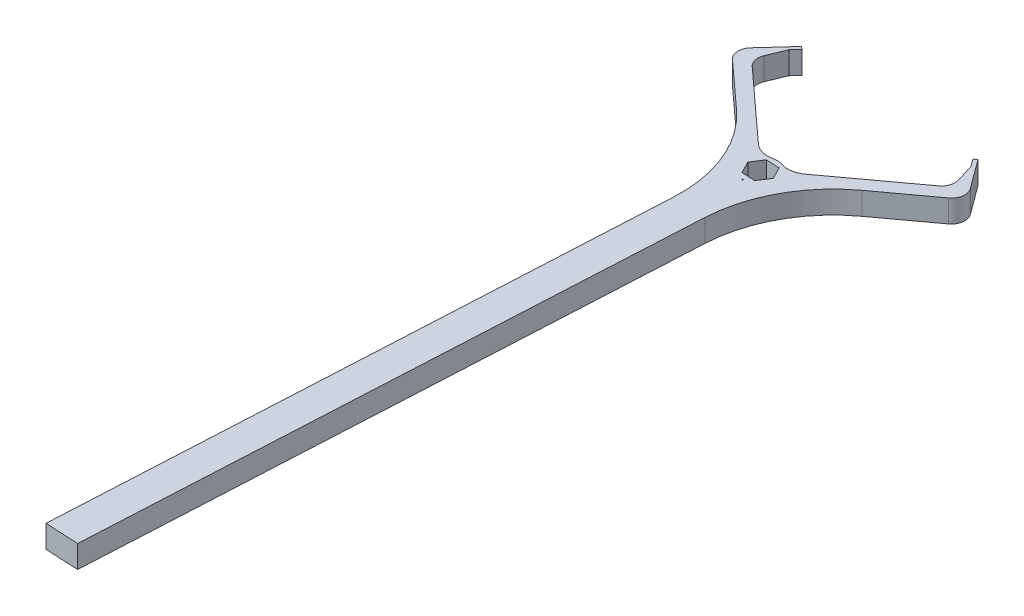
ISO-10303-21;
HEADER;
FILE_DESCRIPTION(('STEP AP214'),'2;1');
FILE_NAME('part.step','',(''),(''),'','','');
FILE_SCHEMA(('AUTOMOTIVE_DESIGN { 1 0 10303 214 1 1 1 1 }'));
ENDSEC;
DATA;
#1=APPLICATION_CONTEXT('core data for automotive mechanical design processes');
#2=APPLICATION_PROTOCOL_DEFINITION('international standard','automotive_design',2000,#1);
#3=PRODUCT_CONTEXT('',#1,'mechanical');
#4=PRODUCT('Part','Part','',(#3));
#5=PRODUCT_RELATED_PRODUCT_CATEGORY('part','',(#4));
#6=PRODUCT_DEFINITION_FORMATION('','',#4);
#7=PRODUCT_DEFINITION_CONTEXT('part definition',#1,'design');
#8=PRODUCT_DEFINITION('design','',#6,#7);
#9=PRODUCT_DEFINITION_SHAPE('','',#8);
#10=(LENGTH_UNIT() NAMED_UNIT(*) SI_UNIT(.MILLI.,.METRE.));
#11=(NAMED_UNIT(*) PLANE_ANGLE_UNIT() SI_UNIT($,.RADIAN.));
#12=(NAMED_UNIT(*) SI_UNIT($,.STERADIAN.) SOLID_ANGLE_UNIT());
#13=UNCERTAINTY_MEASURE_WITH_UNIT(LENGTH_MEASURE(1.E-05),#10,'distance_accuracy_value','');
#14=(GEOMETRIC_REPRESENTATION_CONTEXT(3) GLOBAL_UNCERTAINTY_ASSIGNED_CONTEXT((#13)) GLOBAL_UNIT_ASSIGNED_CONTEXT((#10,
#11,#12)) REPRESENTATION_CONTEXT('',''));
#15=CARTESIAN_POINT('',(0.,0.,0.));
#16=DIRECTION('',(0.,0.,1.));
#17=DIRECTION('',(1.,0.,0.));
#18=AXIS2_PLACEMENT_3D('',#15,#16,#17);
#19=CARTESIAN_POINT('',(-9.82024110292599,0.,187.11250301077));
#20=DIRECTION('',(-0.0524109507479032,0.,0.998625601635418));
#21=DIRECTION('',(0.998625601635418,0.,0.0524109507479032));
#22=AXIS2_PLACEMENT_3D('',#19,#20,#21);
#23=PLANE('',#22);
#24=DIRECTION('',(0.,1.,0.));
#25=VECTOR('',#24,1.);
#26=CARTESIAN_POINT('',(-11.4215991400609,2.5,187.028458803334));
#27=LINE('',#26,#25);
#28=CARTESIAN_POINT('',(-11.4215991400609,-2.5,187.028458803334));
#29=VERTEX_POINT('',#28);
#30=CARTESIAN_POINT('',(-11.4215991400609,2.5,187.028458803334));
#31=VERTEX_POINT('',#30);
#32=EDGE_CURVE('E176',#29,#31,#27,.T.);
#33=ORIENTED_EDGE('',*,*,#32,.F.);
#34=DIRECTION('',(0.998625601635418,0.,0.0524109507479032));
#35=VECTOR('',#34,1.);
#36=CARTESIAN_POINT('',(-9.82024110292599,-2.5,187.11250301077));
#37=LINE('',#36,#35);
#38=CARTESIAN_POINT('',(-4.03176968795879,-2.5,187.416299838869));
#39=VERTEX_POINT('',#38);
#40=EDGE_CURVE('E182',#29,#39,#37,.T.);
#41=ORIENTED_EDGE('',*,*,#40,.T.);
#42=DIRECTION('',(0.,1.,0.));
#43=VECTOR('',#42,1.);
#44=CARTESIAN_POINT('',(-4.0317696879588,2.5,187.416299838869));
#45=LINE('',#44,#43);
#46=CARTESIAN_POINT('',(-4.03176968795879,2.5,187.416299838869));
#47=VERTEX_POINT('',#46);
#48=EDGE_CURVE('E179',#39,#47,#45,.T.);
#49=ORIENTED_EDGE('',*,*,#48,.T.);
#50=DIRECTION('',(0.998625601635418,0.,0.0524109507479032));
#51=VECTOR('',#50,1.);
#52=CARTESIAN_POINT('',(-9.82024110292599,2.5,187.11250301077));
#53=LINE('',#52,#51);
#54=EDGE_CURVE('E172',#31,#47,#53,.T.);
#55=ORIENTED_EDGE('',*,*,#54,.F.);
#56=EDGE_LOOP('',(#33,#41,#49,#55));
#57=FACE_BOUND('',#56,.T.);
#58=ADVANCED_FACE('F35',(#57),#23,.T.);
#59=CARTESIAN_POINT('',(-34.4423896428789,2.5,53.2615811955908));
#60=DIRECTION('',(0.,-1.,0.));
#61=DIRECTION('',(0.,0.,-1.));
#62=AXIS2_PLACEMENT_3D('',#59,#60,#61);
#63=CYLINDRICAL_SURFACE('',#62,30.);
#64=CARTESIAN_POINT('',(-34.4423896428789,2.5,53.2615811955908));
#65=DIRECTION('',(0.,1.,0.));
#66=DIRECTION('',(0.,0.,1.));
#67=AXIS2_PLACEMENT_3D('',#64,#65,#66);
#68=CIRCLE('',#67,30.);
#69=CARTESIAN_POINT('',(-14.2370418585784,2.5,31.0862814024547));
#70=VERTEX_POINT('',#69);
#71=CARTESIAN_POINT('',(-4.48362159381635,2.5,54.8339097180279));
#72=VERTEX_POINT('',#71);
#73=EDGE_CURVE('E336',#70,#72,#68,.F.);
#74=ORIENTED_EDGE('',*,*,#73,.F.);
#75=DIRECTION('',(0.,-1.,0.));
#76=VECTOR('',#75,1.);
#77=CARTESIAN_POINT('',(-14.2370418585784,2.5,31.0862814024547));
#78=LINE('',#77,#76);
#79=CARTESIAN_POINT('',(-14.2370418585784,-2.5,31.0862814024547));
#80=VERTEX_POINT('',#79);
#81=EDGE_CURVE('E347',#80,#70,#78,.F.);
#82=ORIENTED_EDGE('',*,*,#81,.F.);
#83=CARTESIAN_POINT('',(-34.4423896428789,-2.5,53.2615811955908));
#84=DIRECTION('',(0.,1.,0.));
#85=DIRECTION('',(0.,0.,1.));
#86=AXIS2_PLACEMENT_3D('',#83,#84,#85);
#87=CIRCLE('',#86,30.);
#88=CARTESIAN_POINT('',(-4.48362159381635,-2.5,54.8339097180279));
#89=VERTEX_POINT('',#88);
#90=EDGE_CURVE('E339',#89,#80,#87,.T.);
#91=ORIENTED_EDGE('',*,*,#90,.F.);
#92=DIRECTION('',(0.,-1.,0.));
#93=VECTOR('',#92,1.);
#94=CARTESIAN_POINT('',(-4.48362159381635,2.5,54.8339097180279));
#95=LINE('',#94,#93);
#96=EDGE_CURVE('E350',#72,#89,#95,.T.);
#97=ORIENTED_EDGE('',*,*,#96,.F.);
#98=EDGE_LOOP('',(#74,#82,#91,#97));
#99=FACE_BOUND('',#98,.T.);
#100=ADVANCED_FACE('F511',(#99),#63,.F.);
#101=CARTESIAN_POINT('',(-21.9342967580497,2.5,24.0728153533342));
#102=DIRECTION('',(0.673511592810017,0.,-0.739176659771204));
#103=DIRECTION('',(-0.739176659771204,0.,-0.673511592810017));
#104=AXIS2_PLACEMENT_3D('',#101,#102,#103);
#105=PLANE('',#104);
#106=DIRECTION('',(0.739176659771204,0.,0.673511592810017));
#107=VECTOR('',#106,1.);
#108=CARTESIAN_POINT('',(-21.9342967580497,2.5,24.0728153533342));
#109=LINE('',#108,#107);
#110=CARTESIAN_POINT('',(-24.3989513676046,2.5,21.8271093642927));
#111=VERTEX_POINT('',#110);
#112=EDGE_CURVE('E191',#111,#70,#109,.T.);
#113=ORIENTED_EDGE('',*,*,#112,.F.);
#114=DIRECTION('',(0.,-1.,0.));
#115=VECTOR('',#114,1.);
#116=CARTESIAN_POINT('',(-24.3989513676046,2.5,21.8271093642927));
#117=LINE('',#116,#115);
#118=CARTESIAN_POINT('',(-24.3989513676046,-2.5,21.8271093642927));
#119=VERTEX_POINT('',#118);
#120=EDGE_CURVE('E871',#111,#119,#117,.T.);
#121=ORIENTED_EDGE('',*,*,#120,.T.);
#122=DIRECTION('',(0.739176659771204,0.,0.673511592810017));
#123=VECTOR('',#122,1.);
#124=CARTESIAN_POINT('',(-21.9342967580497,-2.5,24.0728153533342));
#125=LINE('',#124,#123);
#126=EDGE_CURVE('E202',#119,#80,#125,.T.);
#127=ORIENTED_EDGE('',*,*,#126,.T.);
#128=ORIENTED_EDGE('',*,*,#81,.T.);
#129=EDGE_LOOP('',(#113,#121,#127,#128));
#130=FACE_BOUND('',#129,.T.);
#131=ADVANCED_FACE('F513',(#130),#105,.F.);
#132=CARTESIAN_POINT('',(-22.3784165891746,2.5,19.6095793849791));
#133=DIRECTION('',(0.,-1.,0.));
#134=DIRECTION('',(0.,0.,-1.));
#135=AXIS2_PLACEMENT_3D('',#132,#133,#134);
#136=CYLINDRICAL_SURFACE('',#135,3.);
#137=CARTESIAN_POINT('',(-22.3784165891746,2.5,19.6095793849791));
#138=DIRECTION('',(0.,1.,0.));
#139=DIRECTION('',(0.,0.,1.));
#140=AXIS2_PLACEMENT_3D('',#137,#138,#139);
#141=CIRCLE('',#140,3.);
#142=CARTESIAN_POINT('',(-24.5959465684882,2.5,17.589044606549));
#143=VERTEX_POINT('',#142);
#144=EDGE_CURVE('E296',#143,#111,#141,.T.);
#145=ORIENTED_EDGE('',*,*,#144,.F.);
#146=DIRECTION('',(0.,-1.,0.));
#147=VECTOR('',#146,1.);
#148=CARTESIAN_POINT('',(-24.5959465684882,2.5,17.589044606549));
#149=LINE('',#148,#147);
#150=CARTESIAN_POINT('',(-24.5959465684882,-2.5,17.589044606549));
#151=VERTEX_POINT('',#150);
#152=EDGE_CURVE('E868',#151,#143,#149,.F.);
#153=ORIENTED_EDGE('',*,*,#152,.F.);
#154=CARTESIAN_POINT('',(-22.3784165891746,-2.5,19.6095793849791));
#155=DIRECTION('',(0.,1.,0.));
#156=DIRECTION('',(0.,0.,1.));
#157=AXIS2_PLACEMENT_3D('',#154,#155,#156);
#158=CIRCLE('',#157,3.);
#159=EDGE_CURVE('E309',#119,#151,#158,.F.);
#160=ORIENTED_EDGE('',*,*,#159,.F.);
#161=ORIENTED_EDGE('',*,*,#120,.F.);
#162=EDGE_LOOP('',(#145,#153,#160,#161));
#163=FACE_BOUND('',#162,.T.);
#164=ADVANCED_FACE('F520',(#163),#136,.T.);
#165=CARTESIAN_POINT('',(-4.6821845888686,2.5,-4.26624076747159));
#166=DIRECTION('',(0.739176659771206,0.,0.673511592810014));
#167=DIRECTION('',(0.673511592810014,0.,-0.739176659771206));
#168=AXIS2_PLACEMENT_3D('',#165,#166,#167);
#169=PLANE('',#168);
#170=DIRECTION('',(-0.673511592810014,0.,0.739176659771206));
#171=VECTOR('',#170,1.);
#172=CARTESIAN_POINT('',(-4.6821845888686,-2.5,-4.26624076747159));
#173=LINE('',#172,#171);
#174=CARTESIAN_POINT('',(-19.2078538260081,-2.5,11.6756313283794));
#175=VERTEX_POINT('',#174);
#176=EDGE_CURVE('E214',#175,#151,#173,.T.);
#177=ORIENTED_EDGE('',*,*,#176,.T.);
#178=ORIENTED_EDGE('',*,*,#152,.T.);
#179=DIRECTION('',(-0.673511592810014,0.,0.739176659771206));
#180=VECTOR('',#179,1.);
#181=CARTESIAN_POINT('',(-4.6821845888686,2.5,-4.26624076747159));
#182=LINE('',#181,#180);
#183=CARTESIAN_POINT('',(-19.2078538260081,2.5,11.6756313283794));
#184=VERTEX_POINT('',#183);
#185=EDGE_CURVE('E250',#184,#143,#182,.T.);
#186=ORIENTED_EDGE('',*,*,#185,.F.);
#187=DIRECTION('',(0.,-1.,0.));
#188=VECTOR('',#187,1.);
#189=CARTESIAN_POINT('',(-19.2078538260081,2.5,11.6756313283794));
#190=LINE('',#189,#188);
#191=EDGE_CURVE('E413',#184,#175,#190,.T.);
#192=ORIENTED_EDGE('',*,*,#191,.T.);
#193=EDGE_LOOP('',(#177,#178,#186,#192));
#194=FACE_BOUND('',#193,.T.);
#195=ADVANCED_FACE('F590',(#194),#169,.F.);
#196=CARTESIAN_POINT('',(-14.5256692371395,2.5,15.9418720958509));
#197=DIRECTION('',(-0.673511592810017,0.,0.739176659771203));
#198=DIRECTION('',(0.739176659771203,0.,0.673511592810017));
#199=AXIS2_PLACEMENT_3D('',#196,#197,#198);
#200=PLANE('',#199);
#201=DIRECTION('',(-0.739176659771203,0.,-0.673511592810017));
#202=VECTOR('',#201,1.);
#203=CARTESIAN_POINT('',(-14.5256692371395,-2.5,15.9418720958509));
#204=LINE('',#203,#202);
#205=CARTESIAN_POINT('',(-18.6165124981911,-2.5,12.2144406026274));
#206=VERTEX_POINT('',#205);
#207=EDGE_CURVE('E217',#206,#175,#204,.T.);
#208=ORIENTED_EDGE('',*,*,#207,.T.);
#209=ORIENTED_EDGE('',*,*,#191,.F.);
#210=DIRECTION('',(-0.739176659771203,0.,-0.673511592810017));
#211=VECTOR('',#210,1.);
#212=CARTESIAN_POINT('',(-14.5256692371395,2.5,15.9418720958509));
#213=LINE('',#212,#211);
#214=CARTESIAN_POINT('',(-18.6165124981911,2.5,12.2144406026274));
#215=VERTEX_POINT('',#214);
#216=EDGE_CURVE('E253',#215,#184,#213,.T.);
#217=ORIENTED_EDGE('',*,*,#216,.F.);
#218=DIRECTION('',(0.,-1.,0.));
#219=VECTOR('',#218,1.);
#220=CARTESIAN_POINT('',(-18.6165124981911,2.5,12.2144406026274));
#221=LINE('',#220,#219);
#222=EDGE_CURVE('E411',#215,#206,#221,.T.);
#223=ORIENTED_EDGE('',*,*,#222,.T.);
#224=EDGE_LOOP('',(#208,#209,#217,#223));
#225=FACE_BOUND('',#224,.T.);
#226=ADVANCED_FACE('F586',(#225),#200,.F.);
#227=CARTESIAN_POINT('',(-4.09084326105156,2.5,-3.72743149322354));
#228=DIRECTION('',(0.739176659771203,0.,0.673511592810017));
#229=DIRECTION('',(0.673511592810017,0.,-0.739176659771203));
#230=AXIS2_PLACEMENT_3D('',#227,#228,#229);
#231=PLANE('',#230);
#232=DIRECTION('',(-0.673511592810017,0.,0.739176659771203));
#233=VECTOR('',#232,1.);
#234=CARTESIAN_POINT('',(-4.09084326105156,-2.5,-3.72743149322354));
#235=LINE('',#234,#233);
#236=CARTESIAN_POINT('',(-20.0034246908169,-2.5,13.7365719703502));
#237=VERTEX_POINT('',#236);
#238=EDGE_CURVE('E219',#206,#237,#235,.T.);
#239=ORIENTED_EDGE('',*,*,#238,.F.);
#240=ORIENTED_EDGE('',*,*,#222,.F.);
#241=DIRECTION('',(-0.673511592810017,0.,0.739176659771203));
#242=VECTOR('',#241,1.);
#243=CARTESIAN_POINT('',(-4.09084326105156,2.5,-3.72743149322354));
#244=LINE('',#243,#242);
#245=CARTESIAN_POINT('',(-20.0034246908169,2.5,13.7365719703502));
#246=VERTEX_POINT('',#245);
#247=EDGE_CURVE('E255',#215,#246,#244,.T.);
#248=ORIENTED_EDGE('',*,*,#247,.T.);
#249=DIRECTION('',(0.,-1.,0.));
#250=VECTOR('',#249,1.);
#251=CARTESIAN_POINT('',(-20.0034246908169,2.5,13.7365719703502));
#252=LINE('',#251,#250);
#253=EDGE_CURVE('E409',#246,#237,#252,.T.);
#254=ORIENTED_EDGE('',*,*,#253,.T.);
#255=EDGE_LOOP('',(#239,#240,#248,#254));
#256=FACE_BOUND('',#255,.T.);
#257=ADVANCED_FACE('F582',(#256),#231,.T.);
#258=CARTESIAN_POINT('',(-12.284519840187,2.5,-5.04793791991461));
#259=DIRECTION('',(0.924953384148559,0.,0.380080566659397));
#260=DIRECTION('',(0.380080566659397,0.,-0.924953384148559));
#261=AXIS2_PLACEMENT_3D('',#258,#259,#260);
#262=PLANE('',#261);
#263=DIRECTION('',(-0.380080566659397,0.,0.924953384148559));
#264=VECTOR('',#263,1.);
#265=CARTESIAN_POINT('',(-12.284519840187,2.5,-5.04793791991461));
#266=LINE('',#265,#264);
#267=CARTESIAN_POINT('',(-21.6079035012912,2.5,17.6411865066487));
#268=VERTEX_POINT('',#267);
#269=EDGE_CURVE('E258',#246,#268,#266,.T.);
#270=ORIENTED_EDGE('',*,*,#269,.T.);
#271=DIRECTION('',(0.,-1.,0.));
#272=VECTOR('',#271,1.);
#273=CARTESIAN_POINT('',(-21.6079035012912,2.5,17.6411865066487));
#274=LINE('',#273,#272);
#275=CARTESIAN_POINT('',(-21.6079035012912,-2.5,17.6411865066487));
#276=VERTEX_POINT('',#275);
#277=EDGE_CURVE('E298',#268,#276,#274,.T.);
#278=ORIENTED_EDGE('',*,*,#277,.T.);
#279=DIRECTION('',(-0.380080566659397,0.,0.924953384148559));
#280=VECTOR('',#279,1.);
#281=CARTESIAN_POINT('',(-12.284519840187,-2.5,-5.04793791991461));
#282=LINE('',#281,#280);
#283=EDGE_CURVE('E222',#237,#276,#282,.T.);
#284=ORIENTED_EDGE('',*,*,#283,.F.);
#285=ORIENTED_EDGE('',*,*,#253,.F.);
#286=EDGE_LOOP('',(#270,#278,#284,#285));
#287=FACE_BOUND('',#286,.T.);
#288=ADVANCED_FACE('F579',(#287),#262,.T.);
#289=CARTESIAN_POINT('',(-18.8330433488455,2.5,18.7814282066269));
#290=DIRECTION('',(0.,-1.,0.));
#291=DIRECTION('',(0.,0.,-1.));
#292=AXIS2_PLACEMENT_3D('',#289,#290,#291);
#293=CYLINDRICAL_SURFACE('',#292,3.);
#294=CARTESIAN_POINT('',(-18.8330433488455,2.5,18.7814282066269));
#295=DIRECTION('',(0.,1.,0.));
#296=DIRECTION('',(0.,0.,1.));
#297=AXIS2_PLACEMENT_3D('',#294,#295,#296);
#298=CIRCLE('',#297,3.);
#299=CARTESIAN_POINT('',(-20.8535781272755,2.5,20.9989581859405));
#300=VERTEX_POINT('',#299);
#301=EDGE_CURVE('E175',#300,#268,#298,.F.);
#302=ORIENTED_EDGE('',*,*,#301,.F.);
#303=DIRECTION('',(0.,-1.,0.));
#304=VECTOR('',#303,1.);
#305=CARTESIAN_POINT('',(-20.8535781272755,2.5,20.9989581859405));
#306=LINE('',#305,#304);
#307=CARTESIAN_POINT('',(-20.8535781272755,-2.5,20.9989581859405));
#308=VERTEX_POINT('',#307);
#309=EDGE_CURVE('E919',#308,#300,#306,.F.);
#310=ORIENTED_EDGE('',*,*,#309,.F.);
#311=CARTESIAN_POINT('',(-18.8330433488455,-2.5,18.7814282066269));
#312=DIRECTION('',(0.,1.,0.));
#313=DIRECTION('',(0.,0.,1.));
#314=AXIS2_PLACEMENT_3D('',#311,#312,#313);
#315=CIRCLE('',#314,3.);
#316=EDGE_CURVE('E914',#276,#308,#315,.T.);
#317=ORIENTED_EDGE('',*,*,#316,.F.);
#318=ORIENTED_EDGE('',*,*,#277,.F.);
#319=EDGE_LOOP('',(#302,#310,#317,#318));
#320=FACE_BOUND('',#319,.T.);
#321=ADVANCED_FACE('F577',(#320),#293,.F.);
#322=CARTESIAN_POINT('',(-19.9137619796197,2.5,21.8552853740205));
#323=DIRECTION('',(-0.673511592810017,0.,0.739176659771204));
#324=DIRECTION('',(0.739176659771204,0.,0.673511592810017));
#325=AXIS2_PLACEMENT_3D('',#322,#323,#324);
#326=PLANE('',#325);
#327=DIRECTION('',(-0.739176659771204,0.,-0.673511592810017));
#328=VECTOR('',#327,1.);
#329=CARTESIAN_POINT('',(-19.9137619796197,-2.5,21.8552853740205));
#330=LINE('',#329,#328);
#331=CARTESIAN_POINT('',(-5.26270941533229,-2.5,35.2048055712232));
#332=VERTEX_POINT('',#331);
#333=EDGE_CURVE('E225',#332,#308,#330,.T.);
#334=ORIENTED_EDGE('',*,*,#333,.T.);
#335=ORIENTED_EDGE('',*,*,#309,.T.);
#336=DIRECTION('',(-0.739176659771204,0.,-0.673511592810017));
#337=VECTOR('',#336,1.);
#338=CARTESIAN_POINT('',(-19.9137619796197,2.5,21.8552853740205));
#339=LINE('',#338,#337);
#340=CARTESIAN_POINT('',(-5.26270941533229,2.5,35.2048055712232));
#341=VERTEX_POINT('',#340);
#342=EDGE_CURVE('E261',#341,#300,#339,.T.);
#343=ORIENTED_EDGE('',*,*,#342,.F.);
#344=DIRECTION('',(0.,1.,0.));
#345=VECTOR('',#344,1.);
#346=CARTESIAN_POINT('',(-5.2627094153323,-2.5,35.2048055712232));
#347=LINE('',#346,#345);
#348=EDGE_CURVE('E326',#341,#332,#347,.F.);
#349=ORIENTED_EDGE('',*,*,#348,.T.);
#350=EDGE_LOOP('',(#334,#335,#343,#349));
#351=FACE_BOUND('',#350,.T.);
#352=ADVANCED_FACE('F574',(#351),#326,.F.);
#353=CARTESIAN_POINT('',(-1.89515145128222,2.5,31.5089222723672));
#354=DIRECTION('',(0.,-1.,0.));
#355=DIRECTION('',(0.,0.,-1.));
#356=AXIS2_PLACEMENT_3D('',#353,#354,#355);
#357=CYLINDRICAL_SURFACE('',#356,5.);
#358=CARTESIAN_POINT('',(-1.89515145128222,2.5,31.5089222723672));
#359=DIRECTION('',(0.,1.,0.));
#360=DIRECTION('',(0.,0.,1.));
#361=AXIS2_PLACEMENT_3D('',#358,#359,#360);
#362=CIRCLE('',#361,5.);
#363=CARTESIAN_POINT('',(-0.805983950545307,2.5,36.3888520008918));
#364=VERTEX_POINT('',#363);
#365=EDGE_CURVE('E315',#364,#341,#362,.F.);
#366=ORIENTED_EDGE('',*,*,#365,.F.);
#367=DIRECTION('',(0.,-1.,0.));
#368=VECTOR('',#367,1.);
#369=CARTESIAN_POINT('',(-0.805983950545307,2.5,36.3888520008918));
#370=LINE('',#369,#368);
#371=CARTESIAN_POINT('',(-0.805983950545307,-2.5,36.3888520008918));
#372=VERTEX_POINT('',#371);
#373=EDGE_CURVE('E333',#372,#364,#370,.F.);
#374=ORIENTED_EDGE('',*,*,#373,.F.);
#375=CARTESIAN_POINT('',(-1.89515145128222,-2.5,31.5089222723672));
#376=DIRECTION('',(0.,1.,0.));
#377=DIRECTION('',(0.,0.,1.));
#378=AXIS2_PLACEMENT_3D('',#375,#376,#377);
#379=CIRCLE('',#378,5.);
#380=EDGE_CURVE('E318',#332,#372,#379,.T.);
#381=ORIENTED_EDGE('',*,*,#380,.F.);
#382=ORIENTED_EDGE('',*,*,#348,.F.);
#383=EDGE_LOOP('',(#366,#374,#381,#382));
#384=FACE_BOUND('',#383,.T.);
#385=ADVANCED_FACE('F539',(#384),#357,.F.);
#386=CARTESIAN_POINT('',(0.,2.5,40.));
#387=DIRECTION('',(0.,-1.,0.));
#388=DIRECTION('',(0.,0.,-1.));
#389=AXIS2_PLACEMENT_3D('',#386,#387,#388);
#390=CYLINDRICAL_SURFACE('',#389,3.69999999999997);
#391=CARTESIAN_POINT('',(0.,2.5,40.));
#392=DIRECTION('',(0.,1.,0.));
#393=DIRECTION('',(0.,0.,1.));
#394=AXIS2_PLACEMENT_3D('',#391,#392,#393);
#395=CIRCLE('',#394,3.69999999999997);
#396=CARTESIAN_POINT('',(1.17956317582169,2.5,36.4930596363432));
#397=VERTEX_POINT('',#396);
#398=EDGE_CURVE('E240',#397,#364,#395,.T.);
#399=ORIENTED_EDGE('',*,*,#398,.F.);
#400=DIRECTION('',(0.,-1.,0.));
#401=VECTOR('',#400,1.);
#402=CARTESIAN_POINT('',(1.17956317582169,2.5,36.4930596363432));
#403=LINE('',#402,#401);
#404=CARTESIAN_POINT('',(1.17956317582169,-2.5,36.4930596363432));
#405=VERTEX_POINT('',#404);
#406=EDGE_CURVE('E330',#397,#405,#403,.T.);
#407=ORIENTED_EDGE('',*,*,#406,.T.);
#408=CARTESIAN_POINT('',(0.,-2.5,40.));
#409=DIRECTION('',(0.,1.,0.));
#410=DIRECTION('',(0.,0.,1.));
#411=AXIS2_PLACEMENT_3D('',#408,#409,#410);
#412=CIRCLE('',#411,3.69999999999997);
#413=EDGE_CURVE('E360',#405,#372,#412,.T.);
#414=ORIENTED_EDGE('',*,*,#413,.T.);
#415=ORIENTED_EDGE('',*,*,#373,.T.);
#416=EDGE_LOOP('',(#399,#407,#414,#415));
#417=FACE_BOUND('',#416,.T.);
#418=ADVANCED_FACE('F536',(#417),#390,.T.);
#419=CARTESIAN_POINT('',(2.77356746747264,2.5,31.753951036807));
#420=DIRECTION('',(0.,-1.,0.));
#421=DIRECTION('',(0.,0.,-1.));
#422=AXIS2_PLACEMENT_3D('',#419,#420,#421);
#423=CYLINDRICAL_SURFACE('',#422,5.);
#424=CARTESIAN_POINT('',(2.77356746747264,2.5,31.753951036807));
#425=DIRECTION('',(0.,1.,0.));
#426=DIRECTION('',(0.,0.,1.));
#427=AXIS2_PLACEMENT_3D('',#424,#425,#426);
#428=CIRCLE('',#427,5.);
#429=CARTESIAN_POINT('',(5.73574762923804,2.5,35.7820385096958));
#430=VERTEX_POINT('',#429);
#431=EDGE_CURVE('E321',#430,#397,#428,.F.);
#432=ORIENTED_EDGE('',*,*,#431,.F.);
#433=DIRECTION('',(0.,-1.,0.));
#434=VECTOR('',#433,1.);
#435=CARTESIAN_POINT('',(5.73574762923804,2.5,35.7820385096958));
#436=LINE('',#435,#434);
#437=CARTESIAN_POINT('',(5.73574762923804,-2.5,35.7820385096958));
#438=VERTEX_POINT('',#437);
#439=EDGE_CURVE('E281',#438,#430,#436,.F.);
#440=ORIENTED_EDGE('',*,*,#439,.F.);
#441=CARTESIAN_POINT('',(2.77356746747264,-2.5,31.753951036807));
#442=DIRECTION('',(0.,1.,0.));
#443=DIRECTION('',(0.,0.,1.));
#444=AXIS2_PLACEMENT_3D('',#441,#442,#443);
#445=CIRCLE('',#444,5.);
#446=EDGE_CURVE('E323',#405,#438,#445,.T.);
#447=ORIENTED_EDGE('',*,*,#446,.F.);
#448=ORIENTED_EDGE('',*,*,#406,.F.);
#449=EDGE_LOOP('',(#432,#440,#447,#448));
#450=FACE_BOUND('',#449,.T.);
#451=ADVANCED_FACE('F528',(#450),#423,.F.);
#452=CARTESIAN_POINT('',(19.091073283275,2.5,25.9607819027896));
#453=DIRECTION('',(-0.59243603235308,0.,-0.805617494577756));
#454=DIRECTION('',(-0.805617494577756,0.,0.59243603235308));
#455=AXIS2_PLACEMENT_3D('',#452,#453,#454);
#456=PLANE('',#455);
#457=DIRECTION('',(0.805617494577756,0.,-0.59243603235308));
#458=VECTOR('',#457,1.);
#459=CARTESIAN_POINT('',(19.091073283275,2.5,25.9607819027896));
#460=LINE('',#459,#458);
#461=CARTESIAN_POINT('',(22.7280003254936,2.5,23.2862538031002));
#462=VERTEX_POINT('',#461);
#463=EDGE_CURVE('E159',#430,#462,#460,.T.);
#464=ORIENTED_EDGE('',*,*,#463,.T.);
#465=DIRECTION('',(0.,-1.,0.));
#466=VECTOR('',#465,1.);
#467=CARTESIAN_POINT('',(22.7280003254936,2.5,23.2862538031002));
#468=LINE('',#467,#466);
#469=CARTESIAN_POINT('',(22.7280003254936,-2.5,23.2862538031002));
#470=VERTEX_POINT('',#469);
#471=EDGE_CURVE('E278',#462,#470,#468,.T.);
#472=ORIENTED_EDGE('',*,*,#471,.T.);
#473=DIRECTION('',(0.805617494577756,0.,-0.59243603235308));
#474=VECTOR('',#473,1.);
#475=CARTESIAN_POINT('',(19.091073283275,-2.5,25.9607819027896));
#476=LINE('',#475,#474);
#477=EDGE_CURVE('E234',#438,#470,#476,.T.);
#478=ORIENTED_EDGE('',*,*,#477,.F.);
#479=ORIENTED_EDGE('',*,*,#439,.T.);
#480=EDGE_LOOP('',(#464,#472,#478,#479));
#481=FACE_BOUND('',#480,.T.);
#482=ADVANCED_FACE('F275',(#481),#456,.T.);
#483=CARTESIAN_POINT('',(20.9506922284344,2.5,20.8694013193669));
#484=DIRECTION('',(0.,-1.,0.));
#485=DIRECTION('',(0.,0.,-1.));
#486=AXIS2_PLACEMENT_3D('',#483,#484,#485);
#487=CYLINDRICAL_SURFACE('',#486,3.);
#488=CARTESIAN_POINT('',(20.9506922284344,2.5,20.8694013193669));
#489=DIRECTION('',(0.,1.,0.));
#490=DIRECTION('',(0.,0.,1.));
#491=AXIS2_PLACEMENT_3D('',#488,#489,#490);
#492=CIRCLE('',#491,3.);
#493=CARTESIAN_POINT('',(23.8296658430167,2.5,20.0258902485808));
#494=VERTEX_POINT('',#493);
#495=EDGE_CURVE('E290',#494,#462,#492,.F.);
#496=ORIENTED_EDGE('',*,*,#495,.F.);
#497=DIRECTION('',(0.,-1.,0.));
#498=VECTOR('',#497,1.);
#499=CARTESIAN_POINT('',(23.8296658430167,2.5,20.0258902485808));
#500=LINE('',#499,#498);
#501=CARTESIAN_POINT('',(23.8296658430167,-2.5,20.0258902485808));
#502=VERTEX_POINT('',#501);
#503=EDGE_CURVE('E155',#502,#494,#500,.F.);
#504=ORIENTED_EDGE('',*,*,#503,.F.);
#505=CARTESIAN_POINT('',(20.9506922284344,-2.5,20.8694013193669));
#506=DIRECTION('',(0.,1.,0.));
#507=DIRECTION('',(0.,0.,1.));
#508=AXIS2_PLACEMENT_3D('',#505,#506,#507);
#509=CIRCLE('',#508,3.);
#510=EDGE_CURVE('E292',#470,#502,#509,.T.);
#511=ORIENTED_EDGE('',*,*,#510,.F.);
#512=ORIENTED_EDGE('',*,*,#471,.F.);
#513=EDGE_LOOP('',(#496,#504,#511,#512));
#514=FACE_BOUND('',#513,.T.);
#515=ADVANCED_FACE('F289',(#514),#487,.F.);
#516=CARTESIAN_POINT('',(16.5422366180475,2.5,-4.84671330512062));
#517=DIRECTION('',(0.95965787152744,0.,-0.281170356928721));
#518=DIRECTION('',(-0.281170356928721,0.,-0.95965787152744));
#519=AXIS2_PLACEMENT_3D('',#516,#517,#518);
#520=PLANE('',#519);
#521=DIRECTION('',(0.281170356928721,0.,0.95965787152744));
#522=VECTOR('',#521,1.);
#523=CARTESIAN_POINT('',(16.5422366180475,-2.5,-4.84671330512062));
#524=LINE('',#523,#522);
#525=CARTESIAN_POINT('',(22.6427283371328,-2.5,15.9747735769133));
#526=VERTEX_POINT('',#525);
#527=EDGE_CURVE('E237',#526,#502,#524,.T.);
#528=ORIENTED_EDGE('',*,*,#527,.T.);
#529=ORIENTED_EDGE('',*,*,#503,.T.);
#530=DIRECTION('',(0.281170356928721,0.,0.95965787152744));
#531=VECTOR('',#530,1.);
#532=CARTESIAN_POINT('',(16.5422366180475,2.5,-4.84671330512062));
#533=LINE('',#532,#531);
#534=CARTESIAN_POINT('',(22.6427283371328,2.5,15.9747735769133));
#535=VERTEX_POINT('',#534);
#536=EDGE_CURVE('E151',#535,#494,#533,.T.);
#537=ORIENTED_EDGE('',*,*,#536,.F.);
#538=DIRECTION('',(0.,-1.,0.));
#539=VECTOR('',#538,1.);
#540=CARTESIAN_POINT('',(22.6427283371328,2.5,15.9747735769133));
#541=LINE('',#540,#539);
#542=EDGE_CURVE('E136',#535,#526,#541,.T.);
#543=ORIENTED_EDGE('',*,*,#542,.T.);
#544=EDGE_LOOP('',(#528,#529,#537,#543));
#545=FACE_BOUND('',#544,.T.);
#546=ADVANCED_FACE('F152',(#545),#520,.F.);
#547=CARTESIAN_POINT('',(7.07118397509604,2.5,-5.20001639294123));
#548=DIRECTION('',(-0.805617494577756,0.,0.59243603235308));
#549=DIRECTION('',(0.59243603235308,0.,0.805617494577756));
#550=AXIS2_PLACEMENT_3D('',#547,#548,#549);
#551=PLANE('',#550);
#552=DIRECTION('',(-0.59243603235308,0.,-0.805617494577756));
#553=VECTOR('',#552,1.);
#554=CARTESIAN_POINT('',(7.07118397509604,-2.5,-5.20001639294123));
#555=LINE('',#554,#553);
#556=CARTESIAN_POINT('',(21.4227689995464,-2.5,14.3158255532264));
#557=VERTEX_POINT('',#556);
#558=EDGE_CURVE('E143',#526,#557,#555,.T.);
#559=ORIENTED_EDGE('',*,*,#558,.F.);
#560=ORIENTED_EDGE('',*,*,#542,.F.);
#561=DIRECTION('',(-0.59243603235308,0.,-0.805617494577756));
#562=VECTOR('',#561,1.);
#563=CARTESIAN_POINT('',(7.07118397509604,2.5,-5.20001639294123));
#564=LINE('',#563,#562);
#565=CARTESIAN_POINT('',(21.4227689995464,2.5,14.3158255532264));
#566=VERTEX_POINT('',#565);
#567=EDGE_CURVE('E140',#535,#566,#564,.T.);
#568=ORIENTED_EDGE('',*,*,#567,.T.);
#569=DIRECTION('',(0.,-1.,0.));
#570=VECTOR('',#569,1.);
#571=CARTESIAN_POINT('',(21.4227689995464,2.5,14.3158255532264));
#572=LINE('',#571,#570);
#573=EDGE_CURVE('E243',#566,#557,#572,.T.);
#574=ORIENTED_EDGE('',*,*,#573,.T.);
#575=EDGE_LOOP('',(#559,#560,#568,#574));
#576=FACE_BOUND('',#575,.T.);
#577=ADVANCED_FACE('F138',(#576),#551,.T.);
#578=CARTESIAN_POINT('',(14.3515850244503,2.5,19.5158419461676));
#579=DIRECTION('',(-0.592436032353079,0.,-0.805617494577756));
#580=DIRECTION('',(-0.805617494577756,0.,0.592436032353079));
#581=AXIS2_PLACEMENT_3D('',#578,#579,#580);
#582=PLANE('',#581);
#583=DIRECTION('',(0.805617494577757,0.,-0.592436032353079));
#584=VECTOR('',#583,1.);
#585=CARTESIAN_POINT('',(14.3515850244503,-2.5,19.5158419461676));
#586=LINE('',#585,#584);
#587=CARTESIAN_POINT('',(22.0672629952086,-2.5,13.8418767273439));
#588=VERTEX_POINT('',#587);
#589=EDGE_CURVE('E165',#557,#588,#586,.T.);
#590=ORIENTED_EDGE('',*,*,#589,.F.);
#591=ORIENTED_EDGE('',*,*,#573,.F.);
#592=DIRECTION('',(0.805617494577757,0.,-0.592436032353079));
#593=VECTOR('',#592,1.);
#594=CARTESIAN_POINT('',(14.3515850244503,2.5,19.5158419461676));
#595=LINE('',#594,#593);
#596=CARTESIAN_POINT('',(22.0672629952086,2.5,13.8418767273439));
#597=VERTEX_POINT('',#596);
#598=EDGE_CURVE('E164',#566,#597,#595,.T.);
#599=ORIENTED_EDGE('',*,*,#598,.T.);
#600=DIRECTION('',(0.,-1.,0.));
#601=VECTOR('',#600,1.);
#602=CARTESIAN_POINT('',(22.0672629952086,2.5,13.8418767273439));
#603=LINE('',#602,#601);
#604=EDGE_CURVE('E416',#597,#588,#603,.T.);
#605=ORIENTED_EDGE('',*,*,#604,.T.);
#606=EDGE_LOOP('',(#590,#591,#599,#605));
#607=FACE_BOUND('',#606,.T.);
#608=ADVANCED_FACE('F422',(#607),#582,.T.);
#609=CARTESIAN_POINT('',(7.71567797075828,2.5,-5.6739652188237));
#610=DIRECTION('',(0.805617494577757,0.,-0.592436032353079));
#611=DIRECTION('',(-0.592436032353079,0.,-0.805617494577757));
#612=AXIS2_PLACEMENT_3D('',#609,#610,#611);
#613=PLANE('',#612);
#614=DIRECTION('',(0.592436032353079,0.,0.805617494577757));
#615=VECTOR('',#614,1.);
#616=CARTESIAN_POINT('',(7.71567797075828,2.5,-5.6739652188237));
#617=LINE('',#616,#615);
#618=CARTESIAN_POINT('',(26.8067512540332,2.5,20.2868166839659));
#619=VERTEX_POINT('',#618);
#620=EDGE_CURVE('E242',#597,#619,#617,.T.);
#621=ORIENTED_EDGE('',*,*,#620,.T.);
#622=DIRECTION('',(0.,-1.,0.));
#623=VECTOR('',#622,1.);
#624=CARTESIAN_POINT('',(26.8067512540332,2.5,20.286816683966));
#625=LINE('',#624,#623);
#626=CARTESIAN_POINT('',(26.8067512540332,-2.5,20.2868166839659));
#627=VERTEX_POINT('',#626);
#628=EDGE_CURVE('E312',#619,#627,#625,.T.);
#629=ORIENTED_EDGE('',*,*,#628,.T.);
#630=DIRECTION('',(0.592436032353079,0.,0.805617494577757));
#631=VECTOR('',#630,1.);
#632=CARTESIAN_POINT('',(7.71567797075828,-2.5,-5.6739652188237));
#633=LINE('',#632,#631);
#634=EDGE_CURVE('E168',#588,#627,#633,.T.);
#635=ORIENTED_EDGE('',*,*,#634,.F.);
#636=ORIENTED_EDGE('',*,*,#604,.F.);
#637=EDGE_LOOP('',(#621,#629,#635,#636));
#638=FACE_BOUND('',#637,.T.);
#639=ADVANCED_FACE('F425',(#638),#613,.T.);
#640=CARTESIAN_POINT('',(24.3898987702999,2.5,22.0641247810252));
#641=DIRECTION('',(0.,-1.,0.));
#642=DIRECTION('',(0.,0.,-1.));
#643=AXIS2_PLACEMENT_3D('',#640,#641,#642);
#644=CYLINDRICAL_SURFACE('',#643,3.);
#645=CARTESIAN_POINT('',(24.3898987702999,2.5,22.0641247810252));
#646=DIRECTION('',(0.,1.,0.));
#647=DIRECTION('',(0.,0.,1.));
#648=AXIS2_PLACEMENT_3D('',#645,#646,#647);
#649=CIRCLE('',#648,3.);
#650=CARTESIAN_POINT('',(26.1672068673592,2.5,24.4809772647585));
#651=VERTEX_POINT('',#650);
#652=EDGE_CURVE('E293',#651,#619,#649,.T.);
#653=ORIENTED_EDGE('',*,*,#652,.F.);
#654=DIRECTION('',(0.,-1.,0.));
#655=VECTOR('',#654,1.);
#656=CARTESIAN_POINT('',(26.1672068673592,2.5,24.4809772647585));
#657=LINE('',#656,#655);
#658=CARTESIAN_POINT('',(26.1672068673592,-2.5,24.4809772647585));
#659=VERTEX_POINT('',#658);
#660=EDGE_CURVE('E304',#659,#651,#657,.F.);
#661=ORIENTED_EDGE('',*,*,#660,.F.);
#662=CARTESIAN_POINT('',(24.3898987702999,-2.5,22.0641247810252));
#663=DIRECTION('',(0.,1.,0.));
#664=DIRECTION('',(0.,0.,1.));
#665=AXIS2_PLACEMENT_3D('',#662,#663,#664);
#666=CIRCLE('',#665,3.);
#667=EDGE_CURVE('E307',#627,#659,#666,.F.);
#668=ORIENTED_EDGE('',*,*,#667,.F.);
#669=ORIENTED_EDGE('',*,*,#628,.F.);
#670=EDGE_LOOP('',(#653,#661,#668,#669));
#671=FACE_BOUND('',#670,.T.);
#672=ADVANCED_FACE('F597',(#671),#644,.T.);
#673=CARTESIAN_POINT('',(20.8683813803342,2.5,28.3776343865229));
#674=DIRECTION('',(0.59243603235308,0.,0.805617494577756));
#675=DIRECTION('',(0.805617494577756,0.,-0.59243603235308));
#676=AXIS2_PLACEMENT_3D('',#673,#674,#675);
#677=PLANE('',#676);
#678=DIRECTION('',(-0.805617494577756,0.,0.59243603235308));
#679=VECTOR('',#678,1.);
#680=CARTESIAN_POINT('',(20.8683813803342,-2.5,28.3776343865229));
#681=LINE('',#680,#679);
#682=CARTESIAN_POINT('',(15.0918949367559,-2.5,32.625554438667));
#683=VERTEX_POINT('',#682);
#684=EDGE_CURVE('E194',#659,#683,#681,.T.);
#685=ORIENTED_EDGE('',*,*,#684,.F.);
#686=ORIENTED_EDGE('',*,*,#660,.T.);
#687=DIRECTION('',(-0.805617494577756,0.,0.59243603235308));
#688=VECTOR('',#687,1.);
#689=CARTESIAN_POINT('',(20.8683813803342,2.5,28.3776343865229));
#690=LINE('',#689,#688);
#691=CARTESIAN_POINT('',(15.0918949367559,2.5,32.625554438667));
#692=VERTEX_POINT('',#691);
#693=EDGE_CURVE('E189',#651,#692,#690,.T.);
#694=ORIENTED_EDGE('',*,*,#693,.T.);
#695=DIRECTION('',(0.,-1.,0.));
#696=VECTOR('',#695,1.);
#697=CARTESIAN_POINT('',(15.0918949367559,2.5,32.625554438667));
#698=LINE('',#697,#696);
#699=EDGE_CURVE('E147',#692,#683,#698,.T.);
#700=ORIENTED_EDGE('',*,*,#699,.T.);
#701=EDGE_LOOP('',(#685,#686,#694,#700));
#702=FACE_BOUND('',#701,.T.);
#703=ADVANCED_FACE('F534',(#702),#677,.T.);
#704=CARTESIAN_POINT('',(32.8649759073483,2.5,56.7940792759996));
#705=DIRECTION('',(0.,-1.,0.));
#706=DIRECTION('',(0.,0.,-1.));
#707=AXIS2_PLACEMENT_3D('',#704,#705,#706);
#708=CYLINDRICAL_SURFACE('',#707,30.);
#709=CARTESIAN_POINT('',(32.8649759073483,2.5,56.7940792759996));
#710=DIRECTION('',(0.,1.,0.));
#711=DIRECTION('',(0.,0.,1.));
#712=AXIS2_PLACEMENT_3D('',#709,#710,#711);
#713=CIRCLE('',#712,30.);
#714=CARTESIAN_POINT('',(2.90620785828572,2.5,55.2217507535625));
#715=VERTEX_POINT('',#714);
#716=EDGE_CURVE('E342',#715,#692,#713,.F.);
#717=ORIENTED_EDGE('',*,*,#716,.F.);
#718=DIRECTION('',(0.,-1.,0.));
#719=VECTOR('',#718,1.);
#720=CARTESIAN_POINT('',(2.90620785828572,2.5,55.2217507535625));
#721=LINE('',#720,#719);
#722=CARTESIAN_POINT('',(2.90620785828572,-2.5,55.2217507535625));
#723=VERTEX_POINT('',#722);
#724=EDGE_CURVE('E353',#723,#715,#721,.F.);
#725=ORIENTED_EDGE('',*,*,#724,.F.);
#726=CARTESIAN_POINT('',(32.8649759073483,-2.5,56.7940792759996));
#727=DIRECTION('',(0.,1.,0.));
#728=DIRECTION('',(0.,0.,1.));
#729=AXIS2_PLACEMENT_3D('',#726,#727,#728);
#730=CIRCLE('',#729,30.);
#731=EDGE_CURVE('E345',#683,#723,#730,.T.);
#732=ORIENTED_EDGE('',*,*,#731,.F.);
#733=ORIENTED_EDGE('',*,*,#699,.F.);
#734=EDGE_LOOP('',(#717,#725,#732,#733));
#735=FACE_BOUND('',#734,.T.);
#736=ADVANCED_FACE('F530',(#735),#708,.F.);
#737=CARTESIAN_POINT('',(5.78847141496748,2.5,0.303796828099219));
#738=DIRECTION('',(-0.998625601635418,0.,-0.0524109507479047));
#739=DIRECTION('',(-0.0524109507479047,0.,0.998625601635418));
#740=AXIS2_PLACEMENT_3D('',#737,#738,#739);
#741=PLANE('',#740);
#742=ORIENTED_EDGE('',*,*,#48,.F.);
#743=DIRECTION('',(0.0524109507479047,0.,-0.998625601635418));
#744=VECTOR('',#743,1.);
#745=CARTESIAN_POINT('',(5.78847141496748,-2.5,0.303796828099219));
#746=LINE('',#745,#744);
#747=EDGE_CURVE('E192',#39,#723,#746,.T.);
#748=ORIENTED_EDGE('',*,*,#747,.T.);
#749=ORIENTED_EDGE('',*,*,#724,.T.);
#750=DIRECTION('',(0.0524109507479047,0.,-0.998625601635418));
#751=VECTOR('',#750,1.);
#752=CARTESIAN_POINT('',(5.78847141496748,2.5,0.303796828099219));
#753=LINE('',#752,#751);
#754=EDGE_CURVE('E185',#47,#715,#753,.T.);
#755=ORIENTED_EDGE('',*,*,#754,.F.);
#756=EDGE_LOOP('',(#742,#748,#749,#755));
#757=FACE_BOUND('',#756,.T.);
#758=ADVANCED_FACE('F533',(#757),#741,.F.);
#759=CARTESIAN_POINT('',(-1.6013580371346,2.5,-0.0840442074352746));
#760=DIRECTION('',(-0.998625601635418,0.,-0.0524109507479048));
#761=DIRECTION('',(-0.0524109507479048,0.,0.998625601635418));
#762=AXIS2_PLACEMENT_3D('',#759,#760,#761);
#763=PLANE('',#762);
#764=DIRECTION('',(0.0524109507479048,0.,-0.998625601635418));
#765=VECTOR('',#764,1.);
#766=CARTESIAN_POINT('',(-1.6013580371346,-2.5,-0.0840442074352746));
#767=LINE('',#766,#765);
#768=EDGE_CURVE('E39',#29,#89,#767,.T.);
#769=ORIENTED_EDGE('',*,*,#768,.F.);
#770=ORIENTED_EDGE('',*,*,#32,.T.);
#771=DIRECTION('',(0.0524109507479048,0.,-0.998625601635418));
#772=VECTOR('',#771,1.);
#773=CARTESIAN_POINT('',(-1.6013580371346,2.5,-0.0840442074352746));
#774=LINE('',#773,#772);
#775=EDGE_CURVE('E188',#31,#72,#774,.T.);
#776=ORIENTED_EDGE('',*,*,#775,.T.);
#777=ORIENTED_EDGE('',*,*,#96,.T.);
#778=EDGE_LOOP('',(#769,#770,#776,#777));
#779=FACE_BOUND('',#778,.T.);
#780=ADVANCED_FACE('F565',(#779),#763,.T.);
#781=CARTESIAN_POINT('',(-21.9342967580497,2.5,24.0728153533342));
#782=DIRECTION('',(0.673511592810017,0.,-0.739176659771204));
#783=DIRECTION('',(-0.739176659771204,0.,-0.673511592810017));
#784=AXIS2_PLACEMENT_3D('',#781,#782,#783);
#785=PLANE('',#784);
#786=DIRECTION('',(0.739176659771204,0.,0.673511592810017));
#787=VECTOR('',#786,1.);
#788=CARTESIAN_POINT('',(-21.9342967580497,-2.5,24.0728153533342));
#789=LINE('',#788,#787);
#790=CARTESIAN_POINT('',(-0.419743658357299,-2.5,43.6761141523718));
#791=VERTEX_POINT('',#790);
#792=CARTESIAN_POINT('',(-0.203285015322852,-2.5,43.8733436015441));
#793=VERTEX_POINT('',#792);
#794=EDGE_CURVE('E228',#791,#793,#789,.T.);
#795=ORIENTED_EDGE('',*,*,#794,.F.);
#796=DIRECTION('',(0.,-1.,0.));
#797=VECTOR('',#796,1.);
#798=CARTESIAN_POINT('',(-0.419743658357299,2.5,43.6761141523718));
#799=LINE('',#798,#797);
#800=CARTESIAN_POINT('',(-0.419743658357299,2.5,43.6761141523718));
#801=VERTEX_POINT('',#800);
#802=EDGE_CURVE('E407',#801,#791,#799,.T.);
#803=ORIENTED_EDGE('',*,*,#802,.F.);
#804=DIRECTION('',(0.739176659771204,0.,0.673511592810017));
#805=VECTOR('',#804,1.);
#806=CARTESIAN_POINT('',(-21.9342967580497,2.5,24.0728153533342));
#807=LINE('',#806,#805);
#808=CARTESIAN_POINT('',(-0.203285015322852,2.5,43.8733436015441));
#809=VERTEX_POINT('',#808);
#810=EDGE_CURVE('E264',#801,#809,#807,.T.);
#811=ORIENTED_EDGE('',*,*,#810,.T.);
#812=DIRECTION('',(0.,-1.,0.));
#813=VECTOR('',#812,1.);
#814=CARTESIAN_POINT('',(-0.203285015322852,2.5,43.8733436015441));
#815=LINE('',#814,#813);
#816=EDGE_CURVE('E405',#809,#793,#815,.T.);
#817=ORIENTED_EDGE('',*,*,#816,.T.);
#818=EDGE_LOOP('',(#795,#803,#811,#817));
#819=FACE_BOUND('',#818,.T.);
#820=ADVANCED_FACE('F554',(#819),#785,.T.);
#821=CARTESIAN_POINT('',(20.8683813803342,2.5,28.3776343865229));
#822=DIRECTION('',(0.59243603235308,0.,0.805617494577756));
#823=DIRECTION('',(0.805617494577756,0.,-0.59243603235308));
#824=AXIS2_PLACEMENT_3D('',#821,#822,#823);
#825=PLANE('',#824);
#826=DIRECTION('',(-0.805617494577756,0.,0.59243603235308));
#827=VECTOR('',#826,1.);
#828=CARTESIAN_POINT('',(20.8683813803342,-2.5,28.3776343865229));
#829=LINE('',#828,#827);
#830=CARTESIAN_POINT('',(0.0326299954880806,-2.5,43.69985611658));
#831=VERTEX_POINT('',#830);
#832=EDGE_CURVE('E231',#831,#793,#829,.T.);
#833=ORIENTED_EDGE('',*,*,#832,.T.);
#834=ORIENTED_EDGE('',*,*,#816,.F.);
#835=DIRECTION('',(-0.805617494577756,0.,0.59243603235308));
#836=VECTOR('',#835,1.);
#837=CARTESIAN_POINT('',(20.8683813803342,2.5,28.3776343865229));
#838=LINE('',#837,#836);
#839=CARTESIAN_POINT('',(0.0326299954880806,2.5,43.69985611658));
#840=VERTEX_POINT('',#839);
#841=EDGE_CURVE('E267',#840,#809,#838,.T.);
#842=ORIENTED_EDGE('',*,*,#841,.F.);
#843=DIRECTION('',(0.,-1.,0.));
#844=VECTOR('',#843,1.);
#845=CARTESIAN_POINT('',(0.0326299954880806,2.5,43.69985611658));
#846=LINE('',#845,#844);
#847=EDGE_CURVE('E130',#840,#831,#846,.T.);
#848=ORIENTED_EDGE('',*,*,#847,.T.);
#849=EDGE_LOOP('',(#833,#834,#842,#848));
#850=FACE_BOUND('',#849,.T.);
#851=ADVANCED_FACE('F550',(#850),#825,.F.);
#852=EDGE_CURVE('E357',#791,#831,#412,.T.);
#853=ORIENTED_EDGE('',*,*,#852,.T.);
#854=ORIENTED_EDGE('',*,*,#847,.F.);
#855=EDGE_CURVE('E361',#801,#840,#395,.T.);
#856=ORIENTED_EDGE('',*,*,#855,.F.);
#857=ORIENTED_EDGE('',*,*,#802,.T.);
#858=EDGE_LOOP('',(#853,#854,#856,#857));
#859=FACE_BOUND('',#858,.T.);
#860=ADVANCED_FACE('F541',(#859),#390,.T.);
#861=CARTESIAN_POINT('',(-1.34967545862808,2.5,37.3506209237426));
#862=DIRECTION('',(0.838629664511838,0.,0.54470201560189));
#863=DIRECTION('',(0.54470201560189,0.,-0.838629664511838));
#864=AXIS2_PLACEMENT_3D('',#861,#862,#863);
#865=PLANE('',#864);
#866=DIRECTION('',(-0.54470201560189,0.,0.838629664511838));
#867=VECTOR('',#866,1.);
#868=CARTESIAN_POINT('',(-1.34967545862808,-2.5,37.3506209237426));
#869=LINE('',#868,#867);
#870=CARTESIAN_POINT('',(-1.34967545862808,-2.5,37.3506209237426));
#871=VERTEX_POINT('',#870);
#872=CARTESIAN_POINT('',(-2.96926731360788,-2.5,39.8441636959077));
#873=VERTEX_POINT('',#872);
#874=EDGE_CURVE('E389',#871,#873,#869,.T.);
#875=ORIENTED_EDGE('',*,*,#874,.F.);
#876=DIRECTION('',(0.,-1.,0.));
#877=VECTOR('',#876,1.);
#878=CARTESIAN_POINT('',(-1.34967545862808,2.5,37.3506209237426));
#879=LINE('',#878,#877);
#880=CARTESIAN_POINT('',(-1.34967545862808,2.5,37.3506209237426));
#881=VERTEX_POINT('',#880);
#882=EDGE_CURVE('E364',#881,#871,#879,.T.);
#883=ORIENTED_EDGE('',*,*,#882,.F.);
#884=DIRECTION('',(-0.54470201560189,0.,0.838629664511838));
#885=VECTOR('',#884,1.);
#886=CARTESIAN_POINT('',(-1.34967545862808,2.5,37.3506209237426));
#887=LINE('',#886,#885);
#888=CARTESIAN_POINT('',(-2.96926731360788,2.5,39.8441636959077));
#889=VERTEX_POINT('',#888);
#890=EDGE_CURVE('E399',#881,#889,#887,.T.);
#891=ORIENTED_EDGE('',*,*,#890,.T.);
#892=DIRECTION('',(0.,-1.,0.));
#893=VECTOR('',#892,1.);
#894=CARTESIAN_POINT('',(-2.96926731360788,2.5,39.8441636959077));
#895=LINE('',#894,#893);
#896=EDGE_CURVE('E366',#889,#873,#895,.T.);
#897=ORIENTED_EDGE('',*,*,#896,.T.);
#898=EDGE_LOOP('',(#875,#883,#891,#897));
#899=FACE_BOUND('',#898,.T.);
#900=ADVANCED_FACE('F478',(#899),#865,.T.);
#901=CARTESIAN_POINT('',(-2.96926731360788,2.5,39.8441636959077));
#902=DIRECTION('',(0.891040615259743,0.,-0.453923586033529));
#903=DIRECTION('',(-0.453923586033528,0.,-0.891040615259743));
#904=AXIS2_PLACEMENT_3D('',#901,#902,#903);
#905=PLANE('',#904);
#906=DIRECTION('',(0.453923586033529,0.,0.891040615259743));
#907=VECTOR('',#906,1.);
#908=CARTESIAN_POINT('',(-2.96926731360788,-2.5,39.8441636959077));
#909=LINE('',#908,#907);
#910=CARTESIAN_POINT('',(-1.6195918549798,-2.5,42.493542772165));
#911=VERTEX_POINT('',#910);
#912=EDGE_CURVE('E386',#873,#911,#909,.T.);
#913=ORIENTED_EDGE('',*,*,#912,.F.);
#914=ORIENTED_EDGE('',*,*,#896,.F.);
#915=DIRECTION('',(0.453923586033529,0.,0.891040615259743));
#916=VECTOR('',#915,1.);
#917=CARTESIAN_POINT('',(-2.96926731360788,2.5,39.8441636959077));
#918=LINE('',#917,#916);
#919=CARTESIAN_POINT('',(-1.6195918549798,2.5,42.493542772165));
#920=VERTEX_POINT('',#919);
#921=EDGE_CURVE('E397',#889,#920,#918,.T.);
#922=ORIENTED_EDGE('',*,*,#921,.T.);
#923=DIRECTION('',(0.,-1.,0.));
#924=VECTOR('',#923,1.);
#925=CARTESIAN_POINT('',(-1.6195918549798,2.5,42.493542772165));
#926=LINE('',#925,#924);
#927=EDGE_CURVE('E369',#920,#911,#926,.T.);
#928=ORIENTED_EDGE('',*,*,#927,.T.);
#929=EDGE_LOOP('',(#913,#914,#922,#928));
#930=FACE_BOUND('',#929,.T.);
#931=ADVANCED_FACE('F483',(#930),#905,.T.);
#932=CARTESIAN_POINT('',(-1.6195918549798,2.5,42.493542772165));
#933=DIRECTION('',(0.0524109507479053,0.,-0.998625601635418));
#934=DIRECTION('',(-0.998625601635418,0.,-0.0524109507479053));
#935=AXIS2_PLACEMENT_3D('',#932,#933,#934);
#936=PLANE('',#935);
#937=DIRECTION('',(0.998625601635418,0.,0.0524109507479053));
#938=VECTOR('',#937,1.);
#939=CARTESIAN_POINT('',(-1.6195918549798,-2.5,42.493542772165));
#940=LINE('',#939,#938);
#941=CARTESIAN_POINT('',(1.34967545862808,-2.5,42.6493790762574));
#942=VERTEX_POINT('',#941);
#943=EDGE_CURVE('E382',#911,#942,#940,.T.);
#944=ORIENTED_EDGE('',*,*,#943,.F.);
#945=ORIENTED_EDGE('',*,*,#927,.F.);
#946=DIRECTION('',(0.998625601635418,0.,0.0524109507479053));
#947=VECTOR('',#946,1.);
#948=CARTESIAN_POINT('',(-1.6195918549798,2.5,42.493542772165));
#949=LINE('',#948,#947);
#950=CARTESIAN_POINT('',(1.34967545862808,2.5,42.6493790762574));
#951=VERTEX_POINT('',#950);
#952=EDGE_CURVE('E394',#920,#951,#949,.T.);
#953=ORIENTED_EDGE('',*,*,#952,.T.);
#954=DIRECTION('',(0.,-1.,0.));
#955=VECTOR('',#954,1.);
#956=CARTESIAN_POINT('',(1.34967545862808,2.5,42.6493790762574));
#957=LINE('',#956,#955);
#958=EDGE_CURVE('E372',#951,#942,#957,.T.);
#959=ORIENTED_EDGE('',*,*,#958,.T.);
#960=EDGE_LOOP('',(#944,#945,#953,#959));
#961=FACE_BOUND('',#960,.T.);
#962=ADVANCED_FACE('F502',(#961),#936,.T.);
#963=CARTESIAN_POINT('',(1.34967545862808,2.5,42.6493790762574));
#964=DIRECTION('',(-0.838629664511839,0.,-0.54470201560189));
#965=DIRECTION('',(-0.54470201560189,0.,0.838629664511839));
#966=AXIS2_PLACEMENT_3D('',#963,#964,#965);
#967=PLANE('',#966);
#968=DIRECTION('',(0.54470201560189,0.,-0.838629664511839));
#969=VECTOR('',#968,1.);
#970=CARTESIAN_POINT('',(1.34967545862808,-2.5,42.6493790762574));
#971=LINE('',#970,#969);
#972=CARTESIAN_POINT('',(2.96926731360788,-2.5,40.1558363040924));
#973=VERTEX_POINT('',#972);
#974=EDGE_CURVE('E379',#942,#973,#971,.T.);
#975=ORIENTED_EDGE('',*,*,#974,.F.);
#976=ORIENTED_EDGE('',*,*,#958,.F.);
#977=DIRECTION('',(0.54470201560189,0.,-0.838629664511839));
#978=VECTOR('',#977,1.);
#979=CARTESIAN_POINT('',(1.34967545862808,2.5,42.6493790762574));
#980=LINE('',#979,#978);
#981=CARTESIAN_POINT('',(2.96926731360788,2.5,40.1558363040924));
#982=VERTEX_POINT('',#981);
#983=EDGE_CURVE('E378',#951,#982,#980,.T.);
#984=ORIENTED_EDGE('',*,*,#983,.T.);
#985=DIRECTION('',(0.,-1.,0.));
#986=VECTOR('',#985,1.);
#987=CARTESIAN_POINT('',(2.96926731360788,2.5,40.1558363040924));
#988=LINE('',#987,#986);
#989=EDGE_CURVE('E375',#982,#973,#988,.T.);
#990=ORIENTED_EDGE('',*,*,#989,.T.);
#991=EDGE_LOOP('',(#975,#976,#984,#990));
#992=FACE_BOUND('',#991,.T.);
#993=ADVANCED_FACE('F494',(#992),#967,.T.);
#994=CARTESIAN_POINT('',(2.96926731360788,2.5,40.1558363040924));
#995=DIRECTION('',(-0.891040615259743,0.,0.453923586033528));
#996=DIRECTION('',(0.453923586033528,0.,0.891040615259743));
#997=AXIS2_PLACEMENT_3D('',#994,#995,#996);
#998=PLANE('',#997);
#999=DIRECTION('',(-0.453923586033528,0.,-0.891040615259743));
#1000=VECTOR('',#999,1.);
#1001=CARTESIAN_POINT('',(2.96926731360788,-2.5,40.1558363040924));
#1002=LINE('',#1001,#1000);
#1003=CARTESIAN_POINT('',(1.61959185497979,-2.5,37.506457227835));
#1004=VERTEX_POINT('',#1003);
#1005=EDGE_CURVE('E11',#973,#1004,#1002,.T.);
#1006=ORIENTED_EDGE('',*,*,#1005,.F.);
#1007=ORIENTED_EDGE('',*,*,#989,.F.);
#1008=DIRECTION('',(-0.453923586033528,0.,-0.891040615259743));
#1009=VECTOR('',#1008,1.);
#1010=CARTESIAN_POINT('',(2.96926731360788,2.5,40.1558363040924));
#1011=LINE('',#1010,#1009);
#1012=CARTESIAN_POINT('',(1.61959185497979,2.5,37.506457227835));
#1013=VERTEX_POINT('',#1012);
#1014=EDGE_CURVE('E383',#982,#1013,#1011,.T.);
#1015=ORIENTED_EDGE('',*,*,#1014,.T.);
#1016=DIRECTION('',(0.,-1.,0.));
#1017=VECTOR('',#1016,1.);
#1018=CARTESIAN_POINT('',(1.61959185497979,2.5,37.506457227835));
#1019=LINE('',#1018,#1017);
#1020=EDGE_CURVE('E359',#1013,#1004,#1019,.T.);
#1021=ORIENTED_EDGE('',*,*,#1020,.T.);
#1022=EDGE_LOOP('',(#1006,#1007,#1015,#1021));
#1023=FACE_BOUND('',#1022,.T.);
#1024=ADVANCED_FACE('F491',(#1023),#998,.T.);
#1025=CARTESIAN_POINT('',(1.61959185497979,2.5,37.506457227835));
#1026=DIRECTION('',(-0.0524109507479032,0.,0.998625601635418));
#1027=DIRECTION('',(0.998625601635418,0.,0.0524109507479032));
#1028=AXIS2_PLACEMENT_3D('',#1025,#1026,#1027);
#1029=PLANE('',#1028);
#1030=DIRECTION('',(-0.998625601635418,0.,-0.0524109507479032));
#1031=VECTOR('',#1030,1.);
#1032=CARTESIAN_POINT('',(1.61959185497979,-2.5,37.506457227835));
#1033=LINE('',#1032,#1031);
#1034=EDGE_CURVE('E45',#1004,#871,#1033,.T.);
#1035=ORIENTED_EDGE('',*,*,#1034,.F.);
#1036=ORIENTED_EDGE('',*,*,#1020,.F.);
#1037=DIRECTION('',(-0.998625601635418,0.,-0.0524109507479032));
#1038=VECTOR('',#1037,1.);
#1039=CARTESIAN_POINT('',(1.61959185497979,2.5,37.506457227835));
#1040=LINE('',#1039,#1038);
#1041=EDGE_CURVE('E401',#1013,#881,#1040,.T.);
#1042=ORIENTED_EDGE('',*,*,#1041,.T.);
#1043=ORIENTED_EDGE('',*,*,#882,.T.);
#1044=EDGE_LOOP('',(#1035,#1036,#1042,#1043));
#1045=FACE_BOUND('',#1044,.T.);
#1046=ADVANCED_FACE('F500',(#1045),#1029,.T.);
#1047=CARTESIAN_POINT('',(0.,2.5,0.));
#1048=DIRECTION('',(0.,1.,0.));
#1049=DIRECTION('',(0.,0.,1.));
#1050=AXIS2_PLACEMENT_3D('',#1047,#1048,#1049);
#1051=PLANE('',#1050);
#1052=ORIENTED_EDGE('',*,*,#1041,.F.);
#1053=ORIENTED_EDGE('',*,*,#1014,.F.);
#1054=ORIENTED_EDGE('',*,*,#983,.F.);
#1055=ORIENTED_EDGE('',*,*,#952,.F.);
#1056=ORIENTED_EDGE('',*,*,#921,.F.);
#1057=ORIENTED_EDGE('',*,*,#890,.F.);
#1058=EDGE_LOOP('',(#1052,#1053,#1054,#1055,#1056,#1057));
#1059=FACE_BOUND('',#1058,.T.);
#1060=ORIENTED_EDGE('',*,*,#855,.T.);
#1061=ORIENTED_EDGE('',*,*,#841,.T.);
#1062=ORIENTED_EDGE('',*,*,#810,.F.);
#1063=EDGE_LOOP('',(#1060,#1061,#1062));
#1064=FACE_BOUND('',#1063,.T.);
#1065=ORIENTED_EDGE('',*,*,#775,.F.);
#1066=ORIENTED_EDGE('',*,*,#54,.T.);
#1067=ORIENTED_EDGE('',*,*,#754,.T.);
#1068=ORIENTED_EDGE('',*,*,#716,.T.);
#1069=ORIENTED_EDGE('',*,*,#693,.F.);
#1070=ORIENTED_EDGE('',*,*,#652,.T.);
#1071=ORIENTED_EDGE('',*,*,#620,.F.);
#1072=ORIENTED_EDGE('',*,*,#598,.F.);
#1073=ORIENTED_EDGE('',*,*,#567,.F.);
#1074=ORIENTED_EDGE('',*,*,#536,.T.);
#1075=ORIENTED_EDGE('',*,*,#495,.T.);
#1076=ORIENTED_EDGE('',*,*,#463,.F.);
#1077=ORIENTED_EDGE('',*,*,#431,.T.);
#1078=ORIENTED_EDGE('',*,*,#398,.T.);
#1079=ORIENTED_EDGE('',*,*,#365,.T.);
#1080=ORIENTED_EDGE('',*,*,#342,.T.);
#1081=ORIENTED_EDGE('',*,*,#301,.T.);
#1082=ORIENTED_EDGE('',*,*,#269,.F.);
#1083=ORIENTED_EDGE('',*,*,#247,.F.);
#1084=ORIENTED_EDGE('',*,*,#216,.T.);
#1085=ORIENTED_EDGE('',*,*,#185,.T.);
#1086=ORIENTED_EDGE('',*,*,#144,.T.);
#1087=ORIENTED_EDGE('',*,*,#112,.T.);
#1088=ORIENTED_EDGE('',*,*,#73,.T.);
#1089=EDGE_LOOP('',(#1065,#1066,#1067,#1068,#1069,#1070,#1071,#1072,#1073,#1074,#1075,#1076,
#1077,#1078,#1079,#1080,#1081,#1082,#1083,#1084,#1085,#1086,#1087,#1088));
#1090=FACE_BOUND('',#1089,.T.);
#1091=ADVANCED_FACE('F37',(#1059,#1064,#1090),#1051,.T.);
#1092=CARTESIAN_POINT('',(0.,-2.5,0.));
#1093=DIRECTION('',(0.,1.,0.));
#1094=DIRECTION('',(0.,0.,1.));
#1095=AXIS2_PLACEMENT_3D('',#1092,#1093,#1094);
#1096=PLANE('',#1095);
#1097=ORIENTED_EDGE('',*,*,#1005,.T.);
#1098=ORIENTED_EDGE('',*,*,#1034,.T.);
#1099=ORIENTED_EDGE('',*,*,#874,.T.);
#1100=ORIENTED_EDGE('',*,*,#912,.T.);
#1101=ORIENTED_EDGE('',*,*,#943,.T.);
#1102=ORIENTED_EDGE('',*,*,#974,.T.);
#1103=EDGE_LOOP('',(#1097,#1098,#1099,#1100,#1101,#1102));
#1104=FACE_BOUND('',#1103,.T.);
#1105=ORIENTED_EDGE('',*,*,#832,.F.);
#1106=ORIENTED_EDGE('',*,*,#852,.F.);
#1107=ORIENTED_EDGE('',*,*,#794,.T.);
#1108=EDGE_LOOP('',(#1105,#1106,#1107));
#1109=FACE_BOUND('',#1108,.T.);
#1110=ORIENTED_EDGE('',*,*,#40,.F.);
#1111=ORIENTED_EDGE('',*,*,#768,.T.);
#1112=ORIENTED_EDGE('',*,*,#90,.T.);
#1113=ORIENTED_EDGE('',*,*,#126,.F.);
#1114=ORIENTED_EDGE('',*,*,#159,.T.);
#1115=ORIENTED_EDGE('',*,*,#176,.F.);
#1116=ORIENTED_EDGE('',*,*,#207,.F.);
#1117=ORIENTED_EDGE('',*,*,#238,.T.);
#1118=ORIENTED_EDGE('',*,*,#283,.T.);
#1119=ORIENTED_EDGE('',*,*,#316,.T.);
#1120=ORIENTED_EDGE('',*,*,#333,.F.);
#1121=ORIENTED_EDGE('',*,*,#380,.T.);
#1122=ORIENTED_EDGE('',*,*,#413,.F.);
#1123=ORIENTED_EDGE('',*,*,#446,.T.);
#1124=ORIENTED_EDGE('',*,*,#477,.T.);
#1125=ORIENTED_EDGE('',*,*,#510,.T.);
#1126=ORIENTED_EDGE('',*,*,#527,.F.);
#1127=ORIENTED_EDGE('',*,*,#558,.T.);
#1128=ORIENTED_EDGE('',*,*,#589,.T.);
#1129=ORIENTED_EDGE('',*,*,#634,.T.);
#1130=ORIENTED_EDGE('',*,*,#667,.T.);
#1131=ORIENTED_EDGE('',*,*,#684,.T.);
#1132=ORIENTED_EDGE('',*,*,#731,.T.);
#1133=ORIENTED_EDGE('',*,*,#747,.F.);
#1134=EDGE_LOOP('',(#1110,#1111,#1112,#1113,#1114,#1115,#1116,#1117,#1118,#1119,#1120,#1121,
#1122,#1123,#1124,#1125,#1126,#1127,#1128,#1129,#1130,#1131,#1132,#1133));
#1135=FACE_BOUND('',#1134,.T.);
#1136=ADVANCED_FACE('F421',(#1104,#1109,#1135),#1096,.F.);
#1137=CLOSED_SHELL('',(#58,#100,#131,#164,#195,#226,#257,#288,#321,#352,#385,#418,#451,#482,
#515,#546,#577,#608,#639,#672,#703,#736,#758,#780,#820,#851,#860,#900,#931,#962,#993,#1024,
#1046,#1091,#1136));
#1138=MANIFOLD_SOLID_BREP('B2',#1137);
#1139=ADVANCED_BREP_SHAPE_REPRESENTATION('',(#18,#1138),#14);
#1140=SHAPE_DEFINITION_REPRESENTATION(#9,#1139);
ENDSEC;
END-ISO-10303-21;
